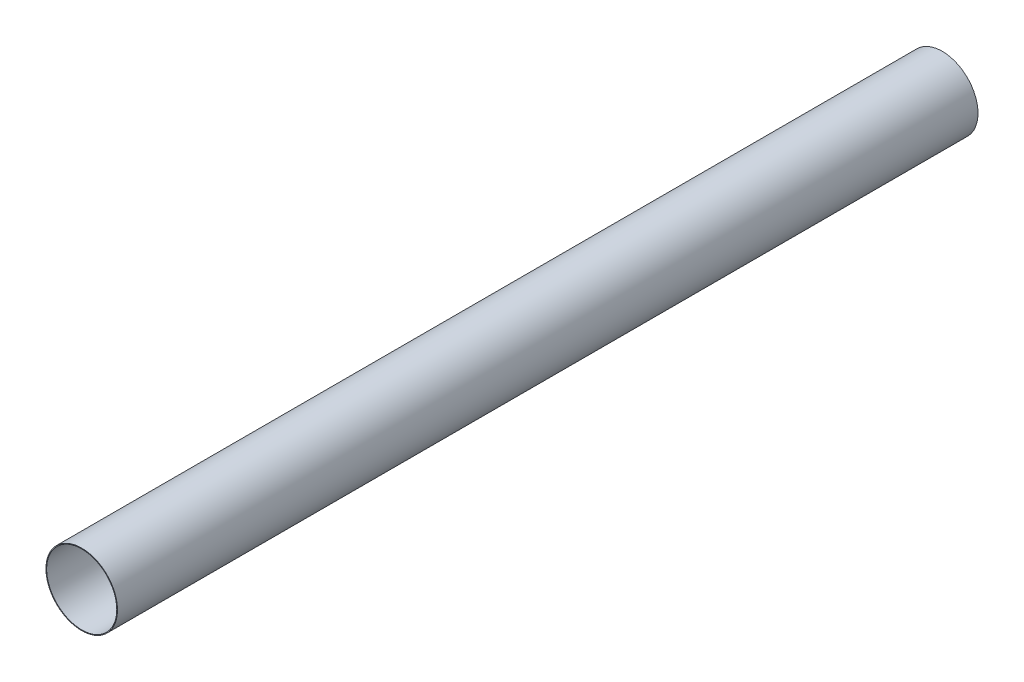
ISO-10303-21;
HEADER;
FILE_DESCRIPTION(('STEP AP214'),'2;1');
FILE_NAME('part.step','',(''),(''),'','','');
FILE_SCHEMA(('AUTOMOTIVE_DESIGN { 1 0 10303 214 1 1 1 1 }'));
ENDSEC;
DATA;
#1=APPLICATION_CONTEXT('core data for automotive mechanical design processes');
#2=APPLICATION_PROTOCOL_DEFINITION('international standard','automotive_design',2000,#1);
#3=PRODUCT_CONTEXT('',#1,'mechanical');
#4=PRODUCT('Part','Part','',(#3));
#5=PRODUCT_RELATED_PRODUCT_CATEGORY('part','',(#4));
#6=PRODUCT_DEFINITION_FORMATION('','',#4);
#7=PRODUCT_DEFINITION_CONTEXT('part definition',#1,'design');
#8=PRODUCT_DEFINITION('design','',#6,#7);
#9=PRODUCT_DEFINITION_SHAPE('','',#8);
#10=(LENGTH_UNIT() NAMED_UNIT(*) SI_UNIT(.MILLI.,.METRE.));
#11=(NAMED_UNIT(*) PLANE_ANGLE_UNIT() SI_UNIT($,.RADIAN.));
#12=(NAMED_UNIT(*) SI_UNIT($,.STERADIAN.) SOLID_ANGLE_UNIT());
#13=UNCERTAINTY_MEASURE_WITH_UNIT(LENGTH_MEASURE(1.E-05),#10,'distance_accuracy_value','');
#14=(GEOMETRIC_REPRESENTATION_CONTEXT(3) GLOBAL_UNCERTAINTY_ASSIGNED_CONTEXT((#13)) GLOBAL_UNIT_ASSIGNED_CONTEXT((#10,
#11,#12)) REPRESENTATION_CONTEXT('',''));
#15=CARTESIAN_POINT('',(0.,0.,0.));
#16=DIRECTION('',(0.,0.,1.));
#17=DIRECTION('',(1.,0.,0.));
#18=AXIS2_PLACEMENT_3D('',#15,#16,#17);
#19=CARTESIAN_POINT('',(0.,0.,1804.));
#20=DIRECTION('',(0.,0.,1.));
#21=DIRECTION('',(1.,0.,0.));
#22=AXIS2_PLACEMENT_3D('',#19,#20,#21);
#23=PLANE('',#22);
#24=CARTESIAN_POINT('',(0.,0.,1804.));
#25=DIRECTION('',(0.,0.,1.));
#26=DIRECTION('',(1.,0.,0.));
#27=AXIS2_PLACEMENT_3D('',#24,#25,#26);
#28=CIRCLE('',#27,75.);
#29=CARTESIAN_POINT('',(75.,0.,1804.));
#30=VERTEX_POINT('',#29);
#31=EDGE_CURVE('E10',#30,#30,#28,.T.);
#32=ORIENTED_EDGE('',*,*,#31,.T.);
#33=EDGE_LOOP('',(#32));
#34=FACE_BOUND('',#33,.T.);
#35=CARTESIAN_POINT('',(0.,0.,1804.));
#36=DIRECTION('',(0.,0.,1.));
#37=DIRECTION('',(1.,0.,0.));
#38=AXIS2_PLACEMENT_3D('',#35,#36,#37);
#39=CIRCLE('',#38,73.5);
#40=CARTESIAN_POINT('',(73.5,0.,1804.));
#41=VERTEX_POINT('',#40);
#42=EDGE_CURVE('E43',#41,#41,#39,.T.);
#43=ORIENTED_EDGE('',*,*,#42,.F.);
#44=EDGE_LOOP('',(#43));
#45=FACE_BOUND('',#44,.T.);
#46=ADVANCED_FACE('F32',(#34,#45),#23,.T.);
#47=CARTESIAN_POINT('',(0.,0.,0.));
#48=DIRECTION('',(0.,0.,1.));
#49=DIRECTION('',(1.,0.,0.));
#50=AXIS2_PLACEMENT_3D('',#47,#48,#49);
#51=PLANE('',#50);
#52=CARTESIAN_POINT('',(0.,0.,0.));
#53=DIRECTION('',(0.,0.,1.));
#54=DIRECTION('',(1.,0.,0.));
#55=AXIS2_PLACEMENT_3D('',#52,#53,#54);
#56=CIRCLE('',#55,75.);
#57=CARTESIAN_POINT('',(75.,0.,0.));
#58=VERTEX_POINT('',#57);
#59=EDGE_CURVE('E36',#58,#58,#56,.T.);
#60=ORIENTED_EDGE('',*,*,#59,.F.);
#61=EDGE_LOOP('',(#60));
#62=FACE_BOUND('',#61,.T.);
#63=CARTESIAN_POINT('',(0.,0.,0.));
#64=DIRECTION('',(0.,0.,1.));
#65=DIRECTION('',(1.,0.,0.));
#66=AXIS2_PLACEMENT_3D('',#63,#64,#65);
#67=CIRCLE('',#66,73.5);
#68=CARTESIAN_POINT('',(73.5,0.,0.));
#69=VERTEX_POINT('',#68);
#70=EDGE_CURVE('E45',#69,#69,#67,.T.);
#71=ORIENTED_EDGE('',*,*,#70,.T.);
#72=EDGE_LOOP('',(#71));
#73=FACE_BOUND('',#72,.T.);
#74=ADVANCED_FACE('F55',(#62,#73),#51,.F.);
#75=CARTESIAN_POINT('',(0.,0.,1804.));
#76=DIRECTION('',(0.,0.,-1.));
#77=DIRECTION('',(-1.,0.,0.));
#78=AXIS2_PLACEMENT_3D('',#75,#76,#77);
#79=CYLINDRICAL_SURFACE('',#78,75.);
#80=ORIENTED_EDGE('',*,*,#31,.F.);
#81=EDGE_LOOP('',(#80));
#82=FACE_BOUND('',#81,.T.);
#83=ORIENTED_EDGE('',*,*,#59,.T.);
#84=EDGE_LOOP('',(#83));
#85=FACE_BOUND('',#84,.T.);
#86=ADVANCED_FACE('F34',(#82,#85),#79,.T.);
#87=CARTESIAN_POINT('',(0.,0.,1804.));
#88=DIRECTION('',(0.,0.,-1.));
#89=DIRECTION('',(-1.,0.,0.));
#90=AXIS2_PLACEMENT_3D('',#87,#88,#89);
#91=CYLINDRICAL_SURFACE('',#90,73.5);
#92=ORIENTED_EDGE('',*,*,#42,.T.);
#93=EDGE_LOOP('',(#92));
#94=FACE_BOUND('',#93,.T.);
#95=ORIENTED_EDGE('',*,*,#70,.F.);
#96=EDGE_LOOP('',(#95));
#97=FACE_BOUND('',#96,.T.);
#98=ADVANCED_FACE('F51',(#94,#97),#91,.F.);
#99=CLOSED_SHELL('',(#46,#74,#86,#98));
#100=MANIFOLD_SOLID_BREP('B2',#99);
#101=ADVANCED_BREP_SHAPE_REPRESENTATION('',(#18,#100),#14);
#102=SHAPE_DEFINITION_REPRESENTATION(#9,#101);
ENDSEC;
END-ISO-10303-21;
